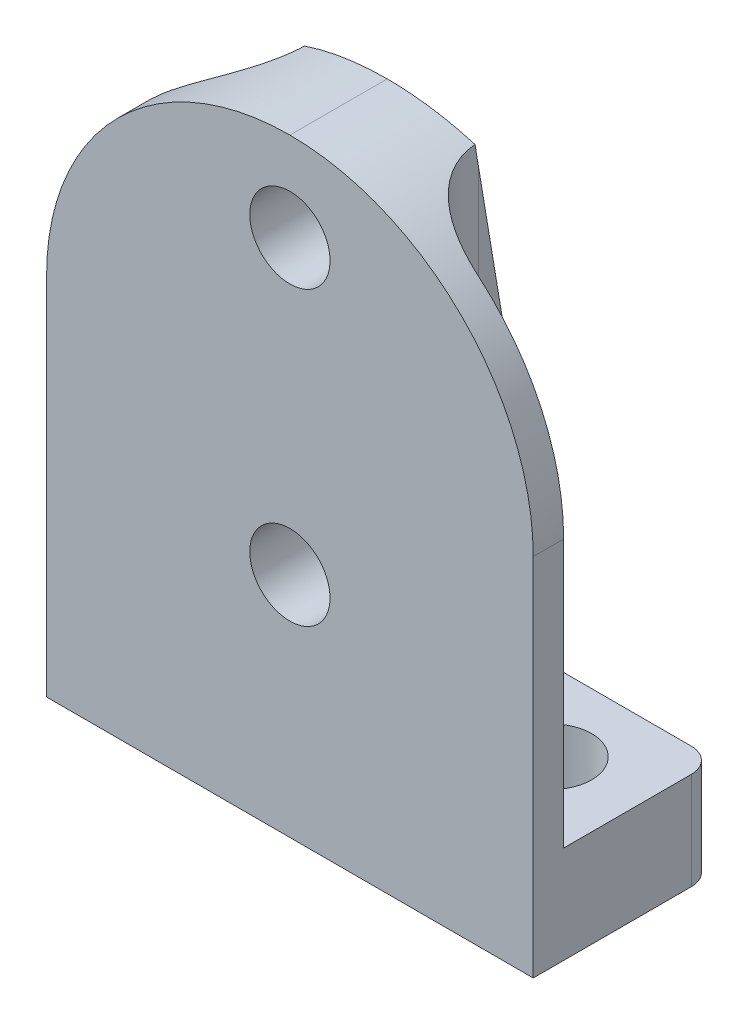
ISO-10303-21;
HEADER;
FILE_DESCRIPTION(('STEP AP214'),'2;1');
FILE_NAME('part.step','',(''),(''),'','','');
FILE_SCHEMA(('AUTOMOTIVE_DESIGN { 1 0 10303 214 1 1 1 1 }'));
ENDSEC;
DATA;
#1=APPLICATION_CONTEXT('core data for automotive mechanical design processes');
#2=APPLICATION_PROTOCOL_DEFINITION('international standard','automotive_design',2000,#1);
#3=PRODUCT_CONTEXT('',#1,'mechanical');
#4=PRODUCT('Part','Part','',(#3));
#5=PRODUCT_RELATED_PRODUCT_CATEGORY('part','',(#4));
#6=PRODUCT_DEFINITION_FORMATION('','',#4);
#7=PRODUCT_DEFINITION_CONTEXT('part definition',#1,'design');
#8=PRODUCT_DEFINITION('design','',#6,#7);
#9=PRODUCT_DEFINITION_SHAPE('','',#8);
#10=(LENGTH_UNIT() NAMED_UNIT(*) SI_UNIT(.MILLI.,.METRE.));
#11=(NAMED_UNIT(*) PLANE_ANGLE_UNIT() SI_UNIT($,.RADIAN.));
#12=(NAMED_UNIT(*) SI_UNIT($,.STERADIAN.) SOLID_ANGLE_UNIT());
#13=UNCERTAINTY_MEASURE_WITH_UNIT(LENGTH_MEASURE(1.E-05),#10,'distance_accuracy_value','');
#14=(GEOMETRIC_REPRESENTATION_CONTEXT(3) GLOBAL_UNCERTAINTY_ASSIGNED_CONTEXT((#13)) GLOBAL_UNIT_ASSIGNED_CONTEXT((#10,
#11,#12)) REPRESENTATION_CONTEXT('',''));
#15=CARTESIAN_POINT('',(0.,0.,0.));
#16=DIRECTION('',(0.,0.,1.));
#17=DIRECTION('',(1.,0.,0.));
#18=AXIS2_PLACEMENT_3D('',#15,#16,#17);
#19=CARTESIAN_POINT('',(16.5,53.5496164882472,-4.25));
#20=DIRECTION('',(0.,-1.,0.));
#21=DIRECTION('',(0.,0.,-1.));
#22=AXIS2_PLACEMENT_3D('',#19,#20,#21);
#23=CYLINDRICAL_SURFACE('',#22,3.);
#24=CARTESIAN_POINT('',(16.5,23.5,-4.25));
#25=DIRECTION('',(0.,-0.164398987305357,0.986393923832144));
#26=DIRECTION('',(0.,-0.986393923832144,-0.164398987305357));
#27=AXIS2_PLACEMENT_3D('',#24,#25,#26);
#28=ELLIPSE('',#27,18.2482875908947,3.);
#29=CARTESIAN_POINT('',(13.5,23.5,-4.25));
#30=VERTEX_POINT('',#29);
#31=CARTESIAN_POINT('',(13.5034756169566,24.3661976597438,-4.10563372337603));
#32=VERTEX_POINT('',#31);
#33=EDGE_CURVE('E223',#30,#32,#28,.F.);
#34=ORIENTED_EDGE('',*,*,#33,.T.);
#35=CARTESIAN_POINT('',(13.5034756169566,24.3661976597438,-4.10563372337603));
#36=CARTESIAN_POINT('',(13.5072946029766,24.3647616904432,-4.02614928841018));
#37=CARTESIAN_POINT('',(13.5142955065258,24.3621475719842,-3.94684341881556));
#38=CARTESIAN_POINT('',(13.5345446805294,24.3545255306198,-3.78915600300985));
#39=CARTESIAN_POINT('',(13.5477924365513,24.3495178048292,-3.71077438123104));
#40=CARTESIAN_POINT('',(13.5803936003539,24.3370807046427,-3.55561271498256));
#41=CARTESIAN_POINT('',(13.5997372759001,24.3296551896632,-3.47883032419498));
#42=CARTESIAN_POINT('',(13.6443239238517,24.3123290753502,-3.3273076602855));
#43=CARTESIAN_POINT('',(13.6695668446653,24.3024284976622,-3.25256736931079));
#44=CARTESIAN_POINT('',(13.7538190343208,24.2689012696937,-3.03214737738324));
#45=CARTESIAN_POINT('',(13.821369303269,24.2414427401482,-2.89018595876464));
#46=CARTESIAN_POINT('',(13.9763631489784,24.1758146182458,-2.62043076711229));
#47=CARTESIAN_POINT('',(14.0638062465567,24.1376452838879,-2.49263665292355));
#48=CARTESIAN_POINT('',(14.2559651229284,24.0497515840719,-2.25297097053411));
#49=CARTESIAN_POINT('',(14.3608489577329,23.9999126519061,-2.14127627202744));
#50=CARTESIAN_POINT('',(14.5828734994293,23.8889058845724,-1.93756861957924));
#51=CARTESIAN_POINT('',(14.7000121483343,23.8277399502568,-1.84555236885384));
#52=CARTESIAN_POINT('',(14.9484336650697,23.6910369395955,-1.67778771856577));
#53=CARTESIAN_POINT('',(15.0801359641017,23.6149151502254,-1.6031431472937));
#54=CARTESIAN_POINT('',(15.3476287764098,23.4514764575689,-1.47619214356583));
#55=CARTESIAN_POINT('',(15.4834265665686,23.3641386048046,-1.4239283267177));
#56=CARTESIAN_POINT('',(15.6940480881609,23.2210759992129,-1.35921944786248));
#57=CARTESIAN_POINT('',(15.7689897119934,23.1686740717978,-1.33941862821227));
#58=CARTESIAN_POINT('',(15.9183238227596,23.0611349946353,-1.30593755326429));
#59=CARTESIAN_POINT('',(15.992716148114,23.0059970742331,-1.29225903344859));
#60=CARTESIAN_POINT('',(16.1401217691612,22.893507454584,-1.27073582961002));
#61=CARTESIAN_POINT('',(16.2131396909905,22.8361665583735,-1.26286575223914));
#62=CARTESIAN_POINT('',(16.3577272191052,22.71932459684,-1.25250019004612));
#63=CARTESIAN_POINT('',(16.4292978994716,22.6598252324983,-1.2500005627403));
#64=CARTESIAN_POINT('',(16.5,22.5993420767853,-1.25));
#65=B_SPLINE_CURVE_WITH_KNOTS('',3,(#35,#36,#37,#38,#39,#40,#41,#42,#43,#44,#45,#46,#47,#48,#49,
#50,#51,#52,#53,#54,#55,#56,#57,#58,#59,#60,#61,#62,#63,#64),.UNSPECIFIED.,.F.,.F.,(4,2,2,2,2,2,
2,2,2,2,2,2,2,2,4),(0.,0.238687985985804,0.477356319289468,0.715645528790855,0.953932654411161,
1.4302560571584,1.90656798733326,2.38776820813903,2.86888774889954,3.37519452314981,
3.88246112439996,4.16294689534932,4.44351212503467,4.72284339379574,5.00195912358845),.UNSPECIFIED.);
#66=CARTESIAN_POINT('',(16.5,22.5993420767853,-1.25));
#67=VERTEX_POINT('',#66);
#68=EDGE_CURVE('E374',#32,#67,#65,.T.);
#69=ORIENTED_EDGE('',*,*,#68,.T.);
#70=DIRECTION('',(0.,1.,0.));
#71=VECTOR('',#70,1.);
#72=CARTESIAN_POINT('',(16.5,-5.01734439843572,-1.25));
#73=LINE('',#72,#71);
#74=CARTESIAN_POINT('',(16.5,4.,-1.25));
#75=VERTEX_POINT('',#74);
#76=EDGE_CURVE('E184',#75,#67,#73,.T.);
#77=ORIENTED_EDGE('',*,*,#76,.F.);
#78=CARTESIAN_POINT('',(16.5,4.,-4.25));
#79=DIRECTION('',(0.,-1.,0.));
#80=DIRECTION('',(0.,0.,-1.));
#81=AXIS2_PLACEMENT_3D('',#78,#79,#80);
#82=CIRCLE('',#81,3.);
#83=CARTESIAN_POINT('',(13.5,4.,-4.25));
#84=VERTEX_POINT('',#83);
#85=EDGE_CURVE('E220',#75,#84,#82,.T.);
#86=ORIENTED_EDGE('',*,*,#85,.T.);
#87=DIRECTION('',(0.,1.,0.));
#88=VECTOR('',#87,1.);
#89=CARTESIAN_POINT('',(13.5,-5.01734439843572,-4.25));
#90=LINE('',#89,#88);
#91=EDGE_CURVE('E158',#84,#30,#90,.T.);
#92=ORIENTED_EDGE('',*,*,#91,.T.);
#93=EDGE_LOOP('',(#34,#69,#77,#86,#92));
#94=FACE_BOUND('',#93,.T.);
#95=ADVANCED_FACE('F37',(#94),#23,.F.);
#96=CARTESIAN_POINT('',(20.,25.,0.));
#97=DIRECTION('',(0.,0.,-1.));
#98=DIRECTION('',(-1.,0.,0.));
#99=AXIS2_PLACEMENT_3D('',#96,#97,#98);
#100=PLANE('',#99);
#101=CARTESIAN_POINT('',(10.,21.35,0.));
#102=DIRECTION('',(0.,0.,-1.));
#103=DIRECTION('',(-1.,0.,0.));
#104=AXIS2_PLACEMENT_3D('',#101,#102,#103);
#105=CIRCLE('',#104,1.65);
#106=CARTESIAN_POINT('',(8.35,21.35,0.));
#107=VERTEX_POINT('',#106);
#108=EDGE_CURVE('E212',#107,#107,#105,.T.);
#109=ORIENTED_EDGE('',*,*,#108,.T.);
#110=EDGE_LOOP('',(#109));
#111=FACE_BOUND('',#110,.T.);
#112=CARTESIAN_POINT('',(10.,9.35,0.));
#113=DIRECTION('',(0.,0.,-1.));
#114=DIRECTION('',(-1.,0.,0.));
#115=AXIS2_PLACEMENT_3D('',#112,#113,#114);
#116=CIRCLE('',#115,1.65);
#117=CARTESIAN_POINT('',(8.35,9.35,0.));
#118=VERTEX_POINT('',#117);
#119=EDGE_CURVE('E216',#118,#118,#116,.T.);
#120=ORIENTED_EDGE('',*,*,#119,.T.);
#121=EDGE_LOOP('',(#120));
#122=FACE_BOUND('',#121,.T.);
#123=CARTESIAN_POINT('',(10.,15.,0.));
#124=DIRECTION('',(0.,0.,-1.));
#125=DIRECTION('',(-1.,0.,0.));
#126=AXIS2_PLACEMENT_3D('',#123,#124,#125);
#127=CIRCLE('',#126,10.);
#128=CARTESIAN_POINT('',(20.,15.,0.));
#129=VERTEX_POINT('',#128);
#130=CARTESIAN_POINT('',(10.,25.,0.));
#131=VERTEX_POINT('',#130);
#132=EDGE_CURVE('E255',#129,#131,#127,.F.);
#133=ORIENTED_EDGE('',*,*,#132,.T.);
#134=CARTESIAN_POINT('',(10.,15.,0.));
#135=DIRECTION('',(0.,0.,-1.));
#136=DIRECTION('',(-1.,0.,0.));
#137=AXIS2_PLACEMENT_3D('',#134,#135,#136);
#138=CIRCLE('',#137,10.);
#139=CARTESIAN_POINT('',(0.,15.,0.));
#140=VERTEX_POINT('',#139);
#141=EDGE_CURVE('E265',#131,#140,#138,.F.);
#142=ORIENTED_EDGE('',*,*,#141,.T.);
#143=DIRECTION('',(0.,-1.,0.));
#144=VECTOR('',#143,1.);
#145=CARTESIAN_POINT('',(0.,25.,0.));
#146=LINE('',#145,#144);
#147=CARTESIAN_POINT('',(0.,0.,0.));
#148=VERTEX_POINT('',#147);
#149=EDGE_CURVE('E233',#140,#148,#146,.T.);
#150=ORIENTED_EDGE('',*,*,#149,.T.);
#151=DIRECTION('',(-1.,0.,0.));
#152=VECTOR('',#151,1.);
#153=CARTESIAN_POINT('',(20.,0.,0.));
#154=LINE('',#153,#152);
#155=CARTESIAN_POINT('',(20.,0.,0.));
#156=VERTEX_POINT('',#155);
#157=EDGE_CURVE('E252',#156,#148,#154,.T.);
#158=ORIENTED_EDGE('',*,*,#157,.F.);
#159=DIRECTION('',(0.,-1.,0.));
#160=VECTOR('',#159,1.);
#161=CARTESIAN_POINT('',(20.,25.,0.));
#162=LINE('',#161,#160);
#163=EDGE_CURVE('E238',#129,#156,#162,.T.);
#164=ORIENTED_EDGE('',*,*,#163,.F.);
#165=EDGE_LOOP('',(#133,#142,#150,#158,#164));
#166=FACE_BOUND('',#165,.T.);
#167=ADVANCED_FACE('F316',(#111,#122,#166),#100,.F.);
#168=CARTESIAN_POINT('',(20.,0.,0.));
#169=DIRECTION('',(0.,1.,0.));
#170=DIRECTION('',(0.,0.,1.));
#171=AXIS2_PLACEMENT_3D('',#168,#169,#170);
#172=PLANE('',#171);
#173=CARTESIAN_POINT('',(16.5,0.,-4.25));
#174=DIRECTION('',(0.,1.,0.));
#175=DIRECTION('',(0.,0.,1.));
#176=AXIS2_PLACEMENT_3D('',#173,#174,#175);
#177=CIRCLE('',#176,1.65);
#178=CARTESIAN_POINT('',(16.5,0.,-2.6));
#179=VERTEX_POINT('',#178);
#180=EDGE_CURVE('E230',#179,#179,#177,.T.);
#181=ORIENTED_EDGE('',*,*,#180,.T.);
#182=EDGE_LOOP('',(#181));
#183=FACE_BOUND('',#182,.T.);
#184=CARTESIAN_POINT('',(3.5,0.,-4.25));
#185=DIRECTION('',(0.,1.,0.));
#186=DIRECTION('',(0.,0.,1.));
#187=AXIS2_PLACEMENT_3D('',#184,#185,#186);
#188=CIRCLE('',#187,1.65);
#189=CARTESIAN_POINT('',(3.5,0.,-2.6));
#190=VERTEX_POINT('',#189);
#191=EDGE_CURVE('E234',#190,#190,#188,.T.);
#192=ORIENTED_EDGE('',*,*,#191,.T.);
#193=EDGE_LOOP('',(#192));
#194=FACE_BOUND('',#193,.T.);
#195=DIRECTION('',(0.,0.,-1.));
#196=VECTOR('',#195,1.);
#197=CARTESIAN_POINT('',(0.,0.,0.));
#198=LINE('',#197,#196);
#199=CARTESIAN_POINT('',(0.,0.,-6.5));
#200=VERTEX_POINT('',#199);
#201=EDGE_CURVE('E241',#148,#200,#198,.T.);
#202=ORIENTED_EDGE('',*,*,#201,.T.);
#203=CARTESIAN_POINT('',(1.,0.,-6.5));
#204=DIRECTION('',(0.,1.,0.));
#205=DIRECTION('',(0.,0.,1.));
#206=AXIS2_PLACEMENT_3D('',#203,#204,#205);
#207=CIRCLE('',#206,1.);
#208=CARTESIAN_POINT('',(1.,0.,-7.5));
#209=VERTEX_POINT('',#208);
#210=EDGE_CURVE('E381',#200,#209,#207,.F.);
#211=ORIENTED_EDGE('',*,*,#210,.T.);
#212=DIRECTION('',(-1.,0.,0.));
#213=VECTOR('',#212,1.);
#214=CARTESIAN_POINT('',(20.,0.,-7.5));
#215=LINE('',#214,#213);
#216=CARTESIAN_POINT('',(19.,0.,-7.5));
#217=VERTEX_POINT('',#216);
#218=EDGE_CURVE('E249',#217,#209,#215,.T.);
#219=ORIENTED_EDGE('',*,*,#218,.F.);
#220=CARTESIAN_POINT('',(19.,0.,-6.5));
#221=DIRECTION('',(0.,1.,0.));
#222=DIRECTION('',(0.,0.,1.));
#223=AXIS2_PLACEMENT_3D('',#220,#221,#222);
#224=CIRCLE('',#223,1.);
#225=CARTESIAN_POINT('',(20.,0.,-6.5));
#226=VERTEX_POINT('',#225);
#227=EDGE_CURVE('E58',#217,#226,#224,.F.);
#228=ORIENTED_EDGE('',*,*,#227,.T.);
#229=DIRECTION('',(0.,0.,-1.));
#230=VECTOR('',#229,1.);
#231=CARTESIAN_POINT('',(20.,0.,0.));
#232=LINE('',#231,#230);
#233=EDGE_CURVE('E240',#156,#226,#232,.T.);
#234=ORIENTED_EDGE('',*,*,#233,.F.);
#235=ORIENTED_EDGE('',*,*,#157,.T.);
#236=EDGE_LOOP('',(#202,#211,#219,#228,#234,#235));
#237=FACE_BOUND('',#236,.T.);
#238=ADVANCED_FACE('F313',(#183,#194,#237),#172,.F.);
#239=CARTESIAN_POINT('',(20.,4.,-7.5));
#240=DIRECTION('',(0.,0.,1.));
#241=DIRECTION('',(0.,-1.,0.));
#242=AXIS2_PLACEMENT_3D('',#239,#240,#241);
#243=PLANE('',#242);
#244=ORIENTED_EDGE('',*,*,#218,.T.);
#245=DIRECTION('',(0.,1.,0.));
#246=VECTOR('',#245,1.);
#247=CARTESIAN_POINT('',(1.,4.,-7.5));
#248=LINE('',#247,#246);
#249=CARTESIAN_POINT('',(1.,4.,-7.5));
#250=VERTEX_POINT('',#249);
#251=EDGE_CURVE('E358',#209,#250,#248,.T.);
#252=ORIENTED_EDGE('',*,*,#251,.T.);
#253=DIRECTION('',(-1.,0.,0.));
#254=VECTOR('',#253,1.);
#255=CARTESIAN_POINT('',(6.5,4.,-7.5));
#256=LINE('',#255,#254);
#257=CARTESIAN_POINT('',(6.5,4.,-7.5));
#258=VERTEX_POINT('',#257);
#259=EDGE_CURVE('E196',#258,#250,#256,.T.);
#260=ORIENTED_EDGE('',*,*,#259,.F.);
#261=DIRECTION('',(-1.,0.,0.));
#262=VECTOR('',#261,1.);
#263=CARTESIAN_POINT('',(20.,4.,-7.5));
#264=LINE('',#263,#262);
#265=CARTESIAN_POINT('',(13.5,4.,-7.5));
#266=VERTEX_POINT('',#265);
#267=EDGE_CURVE('E243',#266,#258,#264,.T.);
#268=ORIENTED_EDGE('',*,*,#267,.F.);
#269=CARTESIAN_POINT('',(19.,4.,-7.5));
#270=VERTEX_POINT('',#269);
#271=EDGE_CURVE('E247',#270,#266,#264,.T.);
#272=ORIENTED_EDGE('',*,*,#271,.F.);
#273=DIRECTION('',(0.,1.,0.));
#274=VECTOR('',#273,1.);
#275=CARTESIAN_POINT('',(19.,0.,-7.5));
#276=LINE('',#275,#274);
#277=EDGE_CURVE('E370',#270,#217,#276,.F.);
#278=ORIENTED_EDGE('',*,*,#277,.T.);
#279=EDGE_LOOP('',(#244,#252,#260,#268,#272,#278));
#280=FACE_BOUND('',#279,.T.);
#281=ADVANCED_FACE('F309',(#280),#243,.F.);
#282=CARTESIAN_POINT('',(20.,25.,-4.));
#283=DIRECTION('',(0.,-0.164398987305357,0.986393923832144));
#284=DIRECTION('',(0.,-0.986393923832144,-0.164398987305357));
#285=AXIS2_PLACEMENT_3D('',#282,#283,#284);
#286=PLANE('',#285);
#287=CARTESIAN_POINT('',(10.,21.35,-4.60833333333333));
#288=DIRECTION('',(0.,-0.164398987305357,0.986393923832144));
#289=DIRECTION('',(0.,0.986393923832144,0.164398987305357));
#290=AXIS2_PLACEMENT_3D('',#287,#288,#289);
#291=ELLIPSE('',#290,3.04138126514911,3.);
#292=CARTESIAN_POINT('',(10.,24.35,-4.10833333333333));
#293=VERTEX_POINT('',#292);
#294=EDGE_CURVE('E203',#293,#293,#291,.F.);
#295=ORIENTED_EDGE('',*,*,#294,.F.);
#296=EDGE_LOOP('',(#295));
#297=FACE_BOUND('',#296,.T.);
#298=CARTESIAN_POINT('',(10.,9.35,-6.60833333333333));
#299=DIRECTION('',(0.,-0.164398987305357,0.986393923832144));
#300=DIRECTION('',(0.,0.986393923832144,0.164398987305357));
#301=AXIS2_PLACEMENT_3D('',#298,#299,#300);
#302=ELLIPSE('',#301,3.04138126514911,3.);
#303=CARTESIAN_POINT('',(10.,12.35,-6.10833333333333));
#304=VERTEX_POINT('',#303);
#305=EDGE_CURVE('E204',#304,#304,#302,.F.);
#306=ORIENTED_EDGE('',*,*,#305,.F.);
#307=EDGE_LOOP('',(#306));
#308=FACE_BOUND('',#307,.T.);
#309=CARTESIAN_POINT('',(3.5,23.5,-4.25));
#310=DIRECTION('',(0.,-0.164398987305357,0.986393923832144));
#311=DIRECTION('',(0.,-0.986393923832144,-0.164398987305357));
#312=AXIS2_PLACEMENT_3D('',#309,#310,#311);
#313=ELLIPSE('',#312,18.2482875908947,3.);
#314=CARTESIAN_POINT('',(6.49652438304342,24.3661976597438,-4.10563372337603));
#315=VERTEX_POINT('',#314);
#316=CARTESIAN_POINT('',(6.5,23.5,-4.25));
#317=VERTEX_POINT('',#316);
#318=EDGE_CURVE('E224',#315,#317,#313,.F.);
#319=ORIENTED_EDGE('',*,*,#318,.F.);
#320=CARTESIAN_POINT('',(10.,15.,-5.66666666666667));
#321=DIRECTION('',(0.,-0.164398987305357,0.986393923832144));
#322=DIRECTION('',(0.,0.986393923832144,0.164398987305357));
#323=AXIS2_PLACEMENT_3D('',#320,#321,#322);
#324=ELLIPSE('',#323,10.137937550497,10.);
#325=CARTESIAN_POINT('',(10.,25.,-4.));
#326=VERTEX_POINT('',#325);
#327=EDGE_CURVE('E440',#315,#326,#324,.F.);
#328=ORIENTED_EDGE('',*,*,#327,.T.);
#329=CARTESIAN_POINT('',(10.,15.,-5.66666666666667));
#330=DIRECTION('',(0.,-0.164398987305357,0.986393923832144));
#331=DIRECTION('',(0.,-0.986393923832144,-0.164398987305357));
#332=AXIS2_PLACEMENT_3D('',#329,#330,#331);
#333=ELLIPSE('',#332,10.137937550497,10.);
#334=EDGE_CURVE('E278',#326,#32,#333,.F.);
#335=ORIENTED_EDGE('',*,*,#334,.T.);
#336=ORIENTED_EDGE('',*,*,#33,.F.);
#337=DIRECTION('',(0.,-0.986393923832144,-0.164398987305357));
#338=VECTOR('',#337,1.);
#339=CARTESIAN_POINT('',(13.5,25.,-4.));
#340=LINE('',#339,#338);
#341=EDGE_CURVE('E195',#30,#266,#340,.T.);
#342=ORIENTED_EDGE('',*,*,#341,.T.);
#343=ORIENTED_EDGE('',*,*,#267,.T.);
#344=DIRECTION('',(0.,0.986393923832144,0.164398987305357));
#345=VECTOR('',#344,1.);
#346=CARTESIAN_POINT('',(6.5,25.,-4.));
#347=LINE('',#346,#345);
#348=EDGE_CURVE('E192',#258,#317,#347,.T.);
#349=ORIENTED_EDGE('',*,*,#348,.T.);
#350=EDGE_LOOP('',(#319,#328,#335,#336,#342,#343,#349));
#351=FACE_BOUND('',#350,.T.);
#352=ADVANCED_FACE('F303',(#297,#308,#351),#286,.F.);
#353=CARTESIAN_POINT('',(20.,0.,0.));
#354=DIRECTION('',(1.,0.,0.));
#355=DIRECTION('',(0.,0.,-1.));
#356=AXIS2_PLACEMENT_3D('',#353,#354,#355);
#357=PLANE('',#356);
#358=ORIENTED_EDGE('',*,*,#233,.T.);
#359=DIRECTION('',(0.,1.,0.));
#360=VECTOR('',#359,1.);
#361=CARTESIAN_POINT('',(20.,4.,-6.5));
#362=LINE('',#361,#360);
#363=CARTESIAN_POINT('',(20.,4.,-6.5));
#364=VERTEX_POINT('',#363);
#365=EDGE_CURVE('E45',#226,#364,#362,.T.);
#366=ORIENTED_EDGE('',*,*,#365,.T.);
#367=DIRECTION('',(0.,0.,-1.));
#368=VECTOR('',#367,1.);
#369=CARTESIAN_POINT('',(20.,4.,-7.5));
#370=LINE('',#369,#368);
#371=CARTESIAN_POINT('',(20.,4.,-1.25));
#372=VERTEX_POINT('',#371);
#373=EDGE_CURVE('E177',#372,#364,#370,.T.);
#374=ORIENTED_EDGE('',*,*,#373,.F.);
#375=DIRECTION('',(0.,1.,0.));
#376=VECTOR('',#375,1.);
#377=CARTESIAN_POINT('',(20.,-5.01734439843572,-1.25));
#378=LINE('',#377,#376);
#379=CARTESIAN_POINT('',(20.,15.,-1.25));
#380=VERTEX_POINT('',#379);
#381=EDGE_CURVE('E180',#372,#380,#378,.T.);
#382=ORIENTED_EDGE('',*,*,#381,.T.);
#383=DIRECTION('',(0.,0.,1.));
#384=VECTOR('',#383,1.);
#385=CARTESIAN_POINT('',(20.,15.,0.));
#386=LINE('',#385,#384);
#387=EDGE_CURVE('E400',#380,#129,#386,.T.);
#388=ORIENTED_EDGE('',*,*,#387,.T.);
#389=ORIENTED_EDGE('',*,*,#163,.T.);
#390=EDGE_LOOP('',(#358,#366,#374,#382,#388,#389));
#391=FACE_BOUND('',#390,.T.);
#392=ADVANCED_FACE('F300',(#391),#357,.T.);
#393=CARTESIAN_POINT('',(0.,0.,0.));
#394=DIRECTION('',(1.,0.,0.));
#395=DIRECTION('',(0.,0.,-1.));
#396=AXIS2_PLACEMENT_3D('',#393,#394,#395);
#397=PLANE('',#396);
#398=DIRECTION('',(0.,0.,1.));
#399=VECTOR('',#398,1.);
#400=CARTESIAN_POINT('',(0.,4.,-7.5));
#401=LINE('',#400,#399);
#402=CARTESIAN_POINT('',(0.,4.,-6.5));
#403=VERTEX_POINT('',#402);
#404=CARTESIAN_POINT('',(0.,4.,-1.25));
#405=VERTEX_POINT('',#404);
#406=EDGE_CURVE('E145',#403,#405,#401,.T.);
#407=ORIENTED_EDGE('',*,*,#406,.F.);
#408=DIRECTION('',(0.,1.,0.));
#409=VECTOR('',#408,1.);
#410=CARTESIAN_POINT('',(0.,0.,-6.5));
#411=LINE('',#410,#409);
#412=EDGE_CURVE('E378',#403,#200,#411,.F.);
#413=ORIENTED_EDGE('',*,*,#412,.T.);
#414=ORIENTED_EDGE('',*,*,#201,.F.);
#415=ORIENTED_EDGE('',*,*,#149,.F.);
#416=DIRECTION('',(0.,0.,1.));
#417=VECTOR('',#416,1.);
#418=CARTESIAN_POINT('',(0.,15.,0.));
#419=LINE('',#418,#417);
#420=CARTESIAN_POINT('',(0.,15.,-1.25));
#421=VERTEX_POINT('',#420);
#422=EDGE_CURVE('E170',#140,#421,#419,.F.);
#423=ORIENTED_EDGE('',*,*,#422,.T.);
#424=DIRECTION('',(0.,1.,0.));
#425=VECTOR('',#424,1.);
#426=CARTESIAN_POINT('',(0.,-5.01734439843572,-1.25));
#427=LINE('',#426,#425);
#428=EDGE_CURVE('E157',#405,#421,#427,.T.);
#429=ORIENTED_EDGE('',*,*,#428,.F.);
#430=EDGE_LOOP('',(#407,#413,#414,#415,#423,#429));
#431=FACE_BOUND('',#430,.T.);
#432=ADVANCED_FACE('F167',(#431),#397,.F.);
#433=CARTESIAN_POINT('',(3.5,-4.66690475583122,-4.25));
#434=DIRECTION('',(0.,1.,0.));
#435=DIRECTION('',(0.,0.,1.));
#436=AXIS2_PLACEMENT_3D('',#433,#434,#435);
#437=CYLINDRICAL_SURFACE('',#436,1.65);
#438=CARTESIAN_POINT('',(3.5,4.,-4.25));
#439=DIRECTION('',(0.,-1.,0.));
#440=DIRECTION('',(0.,0.,-1.));
#441=AXIS2_PLACEMENT_3D('',#438,#439,#440);
#442=CIRCLE('',#441,1.65);
#443=CARTESIAN_POINT('',(3.5,4.,-5.9));
#444=VERTEX_POINT('',#443);
#445=EDGE_CURVE('E237',#444,#444,#442,.T.);
#446=ORIENTED_EDGE('',*,*,#445,.F.);
#447=EDGE_LOOP('',(#446));
#448=FACE_BOUND('',#447,.T.);
#449=ORIENTED_EDGE('',*,*,#191,.F.);
#450=EDGE_LOOP('',(#449));
#451=FACE_BOUND('',#450,.T.);
#452=ADVANCED_FACE('F295',(#448,#451),#437,.F.);
#453=CARTESIAN_POINT('',(16.5,-4.66690475583122,-4.25));
#454=DIRECTION('',(0.,1.,0.));
#455=DIRECTION('',(0.,0.,1.));
#456=AXIS2_PLACEMENT_3D('',#453,#454,#455);
#457=CYLINDRICAL_SURFACE('',#456,1.65);
#458=CARTESIAN_POINT('',(16.5,4.,-4.25));
#459=DIRECTION('',(0.,-1.,0.));
#460=DIRECTION('',(0.,0.,-1.));
#461=AXIS2_PLACEMENT_3D('',#458,#459,#460);
#462=CIRCLE('',#461,1.65);
#463=CARTESIAN_POINT('',(16.5,4.,-5.9));
#464=VERTEX_POINT('',#463);
#465=EDGE_CURVE('E227',#464,#464,#462,.T.);
#466=ORIENTED_EDGE('',*,*,#465,.F.);
#467=EDGE_LOOP('',(#466));
#468=FACE_BOUND('',#467,.T.);
#469=ORIENTED_EDGE('',*,*,#180,.F.);
#470=EDGE_LOOP('',(#469));
#471=FACE_BOUND('',#470,.T.);
#472=ADVANCED_FACE('F292',(#468,#471),#457,.F.);
#473=CARTESIAN_POINT('',(16.5,4.,-4.25));
#474=DIRECTION('',(0.,-1.,0.));
#475=DIRECTION('',(0.,0.,-1.));
#476=AXIS2_PLACEMENT_3D('',#473,#474,#475);
#477=PLANE('',#476);
#478=ORIENTED_EDGE('',*,*,#373,.T.);
#479=CARTESIAN_POINT('',(19.,4.,-6.5));
#480=DIRECTION('',(0.,-1.,0.));
#481=DIRECTION('',(0.,0.,-1.));
#482=AXIS2_PLACEMENT_3D('',#479,#480,#481);
#483=CIRCLE('',#482,1.);
#484=EDGE_CURVE('E11',#364,#270,#483,.F.);
#485=ORIENTED_EDGE('',*,*,#484,.T.);
#486=ORIENTED_EDGE('',*,*,#271,.T.);
#487=DIRECTION('',(0.,0.,1.));
#488=VECTOR('',#487,1.);
#489=CARTESIAN_POINT('',(13.5,4.,-4.25));
#490=LINE('',#489,#488);
#491=EDGE_CURVE('E175',#266,#84,#490,.T.);
#492=ORIENTED_EDGE('',*,*,#491,.T.);
#493=ORIENTED_EDGE('',*,*,#85,.F.);
#494=DIRECTION('',(1.,0.,0.));
#495=VECTOR('',#494,1.);
#496=CARTESIAN_POINT('',(16.5,4.,-1.25));
#497=LINE('',#496,#495);
#498=EDGE_CURVE('E181',#75,#372,#497,.T.);
#499=ORIENTED_EDGE('',*,*,#498,.T.);
#500=EDGE_LOOP('',(#478,#485,#486,#492,#493,#499));
#501=FACE_BOUND('',#500,.T.);
#502=ORIENTED_EDGE('',*,*,#465,.T.);
#503=EDGE_LOOP('',(#502));
#504=FACE_BOUND('',#503,.T.);
#505=ADVANCED_FACE('F289',(#501,#504),#477,.F.);
#506=CARTESIAN_POINT('',(3.5,53.5496164882472,-4.25));
#507=DIRECTION('',(0.,-1.,0.));
#508=DIRECTION('',(0.,0.,-1.));
#509=AXIS2_PLACEMENT_3D('',#506,#507,#508);
#510=CYLINDRICAL_SURFACE('',#509,3.);
#511=DIRECTION('',(0.,1.,0.));
#512=VECTOR('',#511,1.);
#513=CARTESIAN_POINT('',(3.5,-5.01734439843572,-1.25));
#514=LINE('',#513,#512);
#515=CARTESIAN_POINT('',(3.5,4.,-1.25));
#516=VERTEX_POINT('',#515);
#517=CARTESIAN_POINT('',(3.5,22.5993420767853,-1.25));
#518=VERTEX_POINT('',#517);
#519=EDGE_CURVE('E164',#516,#518,#514,.T.);
#520=ORIENTED_EDGE('',*,*,#519,.T.);
#521=CARTESIAN_POINT('',(3.5,22.5993420767853,-1.25));
#522=CARTESIAN_POINT('',(3.59682800081993,22.682198200941,-1.24999797158325));
#523=CARTESIAN_POINT('',(3.69533492472926,22.7632143281807,-1.25469104266445));
#524=CARTESIAN_POINT('',(3.89494531291993,22.9211363070909,-1.27441544700091));
#525=CARTESIAN_POINT('',(3.99605432505012,22.9980320732803,-1.28947100083303));
#526=CARTESIAN_POINT('',(4.20009876861999,23.147221059367,-1.3309696710174));
#527=CARTESIAN_POINT('',(4.30304034103168,23.2194921859055,-1.35746335391386));
#528=CARTESIAN_POINT('',(4.50874720663729,23.3583213645033,-1.42262179639475));
#529=CARTESIAN_POINT('',(4.61151256828678,23.4248857088505,-1.4612729257256));
#530=CARTESIAN_POINT('',(4.85448512368622,23.5761983580994,-1.56874931630119));
#531=CARTESIAN_POINT('',(4.99392800078163,23.6581230360966,-1.6434619657166));
#532=CARTESIAN_POINT('',(5.263571811393,23.8085220334322,-1.81781843019771));
#533=CARTESIAN_POINT('',(5.39379979137697,23.8770368546141,-1.91738503895009));
#534=CARTESIAN_POINT('',(5.64015779622761,24.0006051672157,-2.14108520017086));
#535=CARTESIAN_POINT('',(5.75621195684235,24.0555876937972,-2.26534233550371));
#536=CARTESIAN_POINT('',(5.9676212578167,24.1516928135531,-2.53527936627442));
#537=CARTESIAN_POINT('',(6.06295698357606,24.1928024266196,-2.68097914239177));
#538=CARTESIAN_POINT('',(6.22143918507911,24.2590131086881,-2.9773058901333));
#539=CARTESIAN_POINT('',(6.28650609432419,24.2851070270201,-3.12667845680546));
#540=CARTESIAN_POINT('',(6.36544346624701,24.3161565286811,-3.35787124857542));
#541=CARTESIAN_POINT('',(6.38864109841199,24.3251562539031,-3.43609900411038));
#542=CARTESIAN_POINT('',(6.42862756180446,24.340544121261,-3.59441627361595));
#543=CARTESIAN_POINT('',(6.44541944384209,24.3469335067035,-3.67450488200454));
#544=CARTESIAN_POINT('',(6.46860859443518,24.35571385299,-3.81317043955506));
#545=CARTESIAN_POINT('',(6.47660163034345,24.3587241934387,-3.87144869053044));
#546=CARTESIAN_POINT('',(6.48914351116153,24.3634353688386,-3.98832876248662));
#547=CARTESIAN_POINT('',(6.49369807312346,24.3651383775326,-4.04692988246115));
#548=CARTESIAN_POINT('',(6.49652438304342,24.3661976597438,-4.10563372337603));
#549=B_SPLINE_CURVE_WITH_KNOTS('',3,(#521,#522,#523,#524,#525,#526,#527,#528,#529,#530,#531,
#532,#533,#534,#535,#536,#537,#538,#539,#540,#541,#542,#543,#544,#545,#546,#547,#548),
.UNSPECIFIED.,.F.,.F.,(4,2,2,2,2,2,2,2,2,2,2,2,2,4),(0.,0.382326084612659,0.765548840981979,
1.15048340989179,1.53498794063406,2.06703657251846,2.5974525804812,3.13059355884581,
3.66423199318653,4.15656316944526,4.40257541331502,4.64847034438839,4.82506429920252,
5.00136398570378),.UNSPECIFIED.);
#550=EDGE_CURVE('E270',#518,#315,#549,.T.);
#551=ORIENTED_EDGE('',*,*,#550,.T.);
#552=ORIENTED_EDGE('',*,*,#318,.T.);
#553=DIRECTION('',(0.,1.,0.));
#554=VECTOR('',#553,1.);
#555=CARTESIAN_POINT('',(6.5,-5.01734439843572,-4.25));
#556=LINE('',#555,#554);
#557=CARTESIAN_POINT('',(6.5,4.,-4.25));
#558=VERTEX_POINT('',#557);
#559=EDGE_CURVE('E345',#558,#317,#556,.T.);
#560=ORIENTED_EDGE('',*,*,#559,.F.);
#561=CARTESIAN_POINT('',(3.5,4.,-4.25));
#562=DIRECTION('',(0.,-1.,0.));
#563=DIRECTION('',(0.,0.,-1.));
#564=AXIS2_PLACEMENT_3D('',#561,#562,#563);
#565=CIRCLE('',#564,3.);
#566=EDGE_CURVE('E215',#558,#516,#565,.T.);
#567=ORIENTED_EDGE('',*,*,#566,.T.);
#568=EDGE_LOOP('',(#520,#551,#552,#560,#567));
#569=FACE_BOUND('',#568,.T.);
#570=ADVANCED_FACE('F284',(#569),#510,.F.);
#571=CARTESIAN_POINT('',(3.5,4.,-4.25));
#572=DIRECTION('',(0.,-1.,0.));
#573=DIRECTION('',(0.,0.,-1.));
#574=AXIS2_PLACEMENT_3D('',#571,#572,#573);
#575=PLANE('',#574);
#576=ORIENTED_EDGE('',*,*,#259,.T.);
#577=CARTESIAN_POINT('',(1.,4.,-6.5));
#578=DIRECTION('',(0.,-1.,0.));
#579=DIRECTION('',(0.,0.,-1.));
#580=AXIS2_PLACEMENT_3D('',#577,#578,#579);
#581=CIRCLE('',#580,1.);
#582=EDGE_CURVE('E153',#250,#403,#581,.F.);
#583=ORIENTED_EDGE('',*,*,#582,.T.);
#584=ORIENTED_EDGE('',*,*,#406,.T.);
#585=DIRECTION('',(1.,0.,0.));
#586=VECTOR('',#585,1.);
#587=CARTESIAN_POINT('',(3.5,4.,-1.25));
#588=LINE('',#587,#586);
#589=EDGE_CURVE('E151',#405,#516,#588,.T.);
#590=ORIENTED_EDGE('',*,*,#589,.T.);
#591=ORIENTED_EDGE('',*,*,#566,.F.);
#592=DIRECTION('',(0.,0.,-1.));
#593=VECTOR('',#592,1.);
#594=CARTESIAN_POINT('',(6.5,4.,-4.25));
#595=LINE('',#594,#593);
#596=EDGE_CURVE('E347',#558,#258,#595,.T.);
#597=ORIENTED_EDGE('',*,*,#596,.T.);
#598=EDGE_LOOP('',(#576,#583,#584,#590,#591,#597));
#599=FACE_BOUND('',#598,.T.);
#600=ORIENTED_EDGE('',*,*,#445,.T.);
#601=EDGE_LOOP('',(#600));
#602=FACE_BOUND('',#601,.T.);
#603=ADVANCED_FACE('F148',(#599,#602),#575,.F.);
#604=CARTESIAN_POINT('',(10.,9.35,4.66690475583122));
#605=DIRECTION('',(0.,0.,-1.));
#606=DIRECTION('',(-1.,0.,0.));
#607=AXIS2_PLACEMENT_3D('',#604,#605,#606);
#608=CYLINDRICAL_SURFACE('',#607,1.65);
#609=CARTESIAN_POINT('',(10.,9.35,-4.));
#610=DIRECTION('',(0.,0.,1.));
#611=DIRECTION('',(1.,0.,0.));
#612=AXIS2_PLACEMENT_3D('',#609,#610,#611);
#613=CIRCLE('',#612,1.65);
#614=CARTESIAN_POINT('',(11.65,9.35,-4.));
#615=VERTEX_POINT('',#614);
#616=EDGE_CURVE('E219',#615,#615,#613,.T.);
#617=ORIENTED_EDGE('',*,*,#616,.F.);
#618=EDGE_LOOP('',(#617));
#619=FACE_BOUND('',#618,.T.);
#620=ORIENTED_EDGE('',*,*,#119,.F.);
#621=EDGE_LOOP('',(#620));
#622=FACE_BOUND('',#621,.T.);
#623=ADVANCED_FACE('F405',(#619,#622),#608,.F.);
#624=CARTESIAN_POINT('',(10.,21.35,4.66690475583122));
#625=DIRECTION('',(0.,0.,-1.));
#626=DIRECTION('',(-1.,0.,0.));
#627=AXIS2_PLACEMENT_3D('',#624,#625,#626);
#628=CYLINDRICAL_SURFACE('',#627,1.65);
#629=CARTESIAN_POINT('',(10.,21.35,-4.));
#630=DIRECTION('',(0.,0.,1.));
#631=DIRECTION('',(1.,0.,0.));
#632=AXIS2_PLACEMENT_3D('',#629,#630,#631);
#633=CIRCLE('',#632,1.65);
#634=CARTESIAN_POINT('',(11.65,21.35,-4.));
#635=VERTEX_POINT('',#634);
#636=EDGE_CURVE('E207',#635,#635,#633,.T.);
#637=ORIENTED_EDGE('',*,*,#636,.F.);
#638=EDGE_LOOP('',(#637));
#639=FACE_BOUND('',#638,.T.);
#640=ORIENTED_EDGE('',*,*,#108,.F.);
#641=EDGE_LOOP('',(#640));
#642=FACE_BOUND('',#641,.T.);
#643=ADVANCED_FACE('F408',(#639,#642),#628,.F.);
#644=CARTESIAN_POINT('',(10.,21.35,-15.1521366539739));
#645=DIRECTION('',(0.,0.,1.));
#646=DIRECTION('',(1.,0.,0.));
#647=AXIS2_PLACEMENT_3D('',#644,#645,#646);
#648=CYLINDRICAL_SURFACE('',#647,3.);
#649=ORIENTED_EDGE('',*,*,#294,.T.);
#650=EDGE_LOOP('',(#649));
#651=FACE_BOUND('',#650,.T.);
#652=CARTESIAN_POINT('',(10.,21.35,-4.));
#653=DIRECTION('',(0.,0.,1.));
#654=DIRECTION('',(1.,0.,0.));
#655=AXIS2_PLACEMENT_3D('',#652,#653,#654);
#656=CIRCLE('',#655,3.);
#657=CARTESIAN_POINT('',(13.,21.35,-4.));
#658=VERTEX_POINT('',#657);
#659=EDGE_CURVE('E200',#658,#658,#656,.T.);
#660=ORIENTED_EDGE('',*,*,#659,.T.);
#661=EDGE_LOOP('',(#660));
#662=FACE_BOUND('',#661,.T.);
#663=ADVANCED_FACE('F412',(#651,#662),#648,.F.);
#664=CARTESIAN_POINT('',(10.,21.35,-4.));
#665=DIRECTION('',(0.,0.,1.));
#666=DIRECTION('',(1.,0.,0.));
#667=AXIS2_PLACEMENT_3D('',#664,#665,#666);
#668=PLANE('',#667);
#669=ORIENTED_EDGE('',*,*,#636,.T.);
#670=EDGE_LOOP('',(#669));
#671=FACE_BOUND('',#670,.T.);
#672=ORIENTED_EDGE('',*,*,#659,.F.);
#673=EDGE_LOOP('',(#672));
#674=FACE_BOUND('',#673,.T.);
#675=ADVANCED_FACE('F418',(#671,#674),#668,.F.);
#676=CARTESIAN_POINT('',(10.,9.35,-15.1521366539739));
#677=DIRECTION('',(0.,0.,1.));
#678=DIRECTION('',(1.,0.,0.));
#679=AXIS2_PLACEMENT_3D('',#676,#677,#678);
#680=CYLINDRICAL_SURFACE('',#679,3.);
#681=ORIENTED_EDGE('',*,*,#305,.T.);
#682=EDGE_LOOP('',(#681));
#683=FACE_BOUND('',#682,.T.);
#684=CARTESIAN_POINT('',(10.,9.35,-4.));
#685=DIRECTION('',(0.,0.,1.));
#686=DIRECTION('',(1.,0.,0.));
#687=AXIS2_PLACEMENT_3D('',#684,#685,#686);
#688=CIRCLE('',#687,3.);
#689=CARTESIAN_POINT('',(13.,9.35,-4.));
#690=VERTEX_POINT('',#689);
#691=EDGE_CURVE('E199',#690,#690,#688,.T.);
#692=ORIENTED_EDGE('',*,*,#691,.T.);
#693=EDGE_LOOP('',(#692));
#694=FACE_BOUND('',#693,.T.);
#695=ADVANCED_FACE('F414',(#683,#694),#680,.F.);
#696=CARTESIAN_POINT('',(10.,9.35,-4.));
#697=DIRECTION('',(0.,0.,1.));
#698=DIRECTION('',(1.,0.,0.));
#699=AXIS2_PLACEMENT_3D('',#696,#697,#698);
#700=PLANE('',#699);
#701=ORIENTED_EDGE('',*,*,#616,.T.);
#702=EDGE_LOOP('',(#701));
#703=FACE_BOUND('',#702,.T.);
#704=ORIENTED_EDGE('',*,*,#691,.F.);
#705=EDGE_LOOP('',(#704));
#706=FACE_BOUND('',#705,.T.);
#707=ADVANCED_FACE('F417',(#703,#706),#700,.F.);
#708=CARTESIAN_POINT('',(6.5,-5.01734439843572,-4.25));
#709=DIRECTION('',(1.,0.,0.));
#710=DIRECTION('',(0.,0.,-1.));
#711=AXIS2_PLACEMENT_3D('',#708,#709,#710);
#712=PLANE('',#711);
#713=ORIENTED_EDGE('',*,*,#596,.F.);
#714=ORIENTED_EDGE('',*,*,#559,.T.);
#715=ORIENTED_EDGE('',*,*,#348,.F.);
#716=EDGE_LOOP('',(#713,#714,#715));
#717=FACE_BOUND('',#716,.T.);
#718=ADVANCED_FACE('F422',(#717),#712,.F.);
#719=CARTESIAN_POINT('',(3.5,-5.01734439843572,-1.25));
#720=DIRECTION('',(0.,0.,1.));
#721=DIRECTION('',(1.,0.,0.));
#722=AXIS2_PLACEMENT_3D('',#719,#720,#721);
#723=PLANE('',#722);
#724=ORIENTED_EDGE('',*,*,#428,.T.);
#725=CARTESIAN_POINT('',(10.,15.,-1.25));
#726=DIRECTION('',(0.,0.,1.));
#727=DIRECTION('',(1.,0.,0.));
#728=AXIS2_PLACEMENT_3D('',#725,#726,#727);
#729=CIRCLE('',#728,10.);
#730=EDGE_CURVE('E268',#421,#518,#729,.F.);
#731=ORIENTED_EDGE('',*,*,#730,.T.);
#732=ORIENTED_EDGE('',*,*,#519,.F.);
#733=ORIENTED_EDGE('',*,*,#589,.F.);
#734=EDGE_LOOP('',(#724,#731,#732,#733));
#735=FACE_BOUND('',#734,.T.);
#736=ADVANCED_FACE('F162',(#735),#723,.F.);
#737=CARTESIAN_POINT('',(13.5,-5.01734439843572,-4.25));
#738=DIRECTION('',(-1.,0.,0.));
#739=DIRECTION('',(0.,0.,1.));
#740=AXIS2_PLACEMENT_3D('',#737,#738,#739);
#741=PLANE('',#740);
#742=ORIENTED_EDGE('',*,*,#91,.F.);
#743=ORIENTED_EDGE('',*,*,#491,.F.);
#744=ORIENTED_EDGE('',*,*,#341,.F.);
#745=EDGE_LOOP('',(#742,#743,#744));
#746=FACE_BOUND('',#745,.T.);
#747=ADVANCED_FACE('F364',(#746),#741,.F.);
#748=CARTESIAN_POINT('',(16.5,-5.01734439843572,-1.25));
#749=DIRECTION('',(0.,0.,1.));
#750=DIRECTION('',(1.,0.,0.));
#751=AXIS2_PLACEMENT_3D('',#748,#749,#750);
#752=PLANE('',#751);
#753=ORIENTED_EDGE('',*,*,#76,.T.);
#754=CARTESIAN_POINT('',(10.,15.,-1.25));
#755=DIRECTION('',(0.,0.,1.));
#756=DIRECTION('',(1.,0.,0.));
#757=AXIS2_PLACEMENT_3D('',#754,#755,#756);
#758=CIRCLE('',#757,10.);
#759=EDGE_CURVE('E371',#67,#380,#758,.F.);
#760=ORIENTED_EDGE('',*,*,#759,.T.);
#761=ORIENTED_EDGE('',*,*,#381,.F.);
#762=ORIENTED_EDGE('',*,*,#498,.F.);
#763=EDGE_LOOP('',(#753,#760,#761,#762));
#764=FACE_BOUND('',#763,.T.);
#765=ADVANCED_FACE('F393',(#764),#752,.F.);
#766=CARTESIAN_POINT('',(10.,15.,0.));
#767=DIRECTION('',(0.,0.,-1.));
#768=DIRECTION('',(-1.,0.,0.));
#769=AXIS2_PLACEMENT_3D('',#766,#767,#768);
#770=CYLINDRICAL_SURFACE('',#769,10.);
#771=ORIENTED_EDGE('',*,*,#68,.F.);
#772=ORIENTED_EDGE('',*,*,#334,.F.);
#773=DIRECTION('',(0.,0.,1.));
#774=VECTOR('',#773,1.);
#775=CARTESIAN_POINT('',(10.,25.,-1.25));
#776=LINE('',#775,#774);
#777=EDGE_CURVE('E189',#131,#326,#776,.F.);
#778=ORIENTED_EDGE('',*,*,#777,.F.);
#779=ORIENTED_EDGE('',*,*,#132,.F.);
#780=ORIENTED_EDGE('',*,*,#387,.F.);
#781=ORIENTED_EDGE('',*,*,#759,.F.);
#782=EDGE_LOOP('',(#771,#772,#778,#779,#780,#781));
#783=FACE_BOUND('',#782,.T.);
#784=ADVANCED_FACE('F338',(#783),#770,.T.);
#785=CARTESIAN_POINT('',(10.,15.,0.));
#786=DIRECTION('',(0.,0.,1.));
#787=DIRECTION('',(1.,0.,0.));
#788=AXIS2_PLACEMENT_3D('',#785,#786,#787);
#789=CYLINDRICAL_SURFACE('',#788,10.);
#790=ORIENTED_EDGE('',*,*,#730,.F.);
#791=ORIENTED_EDGE('',*,*,#422,.F.);
#792=ORIENTED_EDGE('',*,*,#141,.F.);
#793=ORIENTED_EDGE('',*,*,#777,.T.);
#794=ORIENTED_EDGE('',*,*,#327,.F.);
#795=ORIENTED_EDGE('',*,*,#550,.F.);
#796=EDGE_LOOP('',(#790,#791,#792,#793,#794,#795));
#797=FACE_BOUND('',#796,.T.);
#798=ADVANCED_FACE('F280',(#797),#789,.T.);
#799=CARTESIAN_POINT('',(1.,4.,-6.5));
#800=DIRECTION('',(0.,1.,0.));
#801=DIRECTION('',(0.,0.,1.));
#802=AXIS2_PLACEMENT_3D('',#799,#800,#801);
#803=CYLINDRICAL_SURFACE('',#802,1.);
#804=ORIENTED_EDGE('',*,*,#210,.F.);
#805=ORIENTED_EDGE('',*,*,#412,.F.);
#806=ORIENTED_EDGE('',*,*,#582,.F.);
#807=ORIENTED_EDGE('',*,*,#251,.F.);
#808=EDGE_LOOP('',(#804,#805,#806,#807));
#809=FACE_BOUND('',#808,.T.);
#810=ADVANCED_FACE('F385',(#809),#803,.T.);
#811=CARTESIAN_POINT('',(19.,0.,-6.5));
#812=DIRECTION('',(0.,-1.,0.));
#813=DIRECTION('',(0.,0.,-1.));
#814=AXIS2_PLACEMENT_3D('',#811,#812,#813);
#815=CYLINDRICAL_SURFACE('',#814,1.);
#816=ORIENTED_EDGE('',*,*,#227,.F.);
#817=ORIENTED_EDGE('',*,*,#277,.F.);
#818=ORIENTED_EDGE('',*,*,#484,.F.);
#819=ORIENTED_EDGE('',*,*,#365,.F.);
#820=EDGE_LOOP('',(#816,#817,#818,#819));
#821=FACE_BOUND('',#820,.T.);
#822=ADVANCED_FACE('F39',(#821),#815,.T.);
#823=CLOSED_SHELL('',(#95,#167,#238,#281,#352,#392,#432,#452,#472,#505,#570,#603,#623,#643,#663,
#675,#695,#707,#718,#736,#747,#765,#784,#798,#810,#822));
#824=MANIFOLD_SOLID_BREP('B2',#823);
#825=ADVANCED_BREP_SHAPE_REPRESENTATION('',(#18,#824),#14);
#826=SHAPE_DEFINITION_REPRESENTATION(#9,#825);
ENDSEC;
END-ISO-10303-21;
